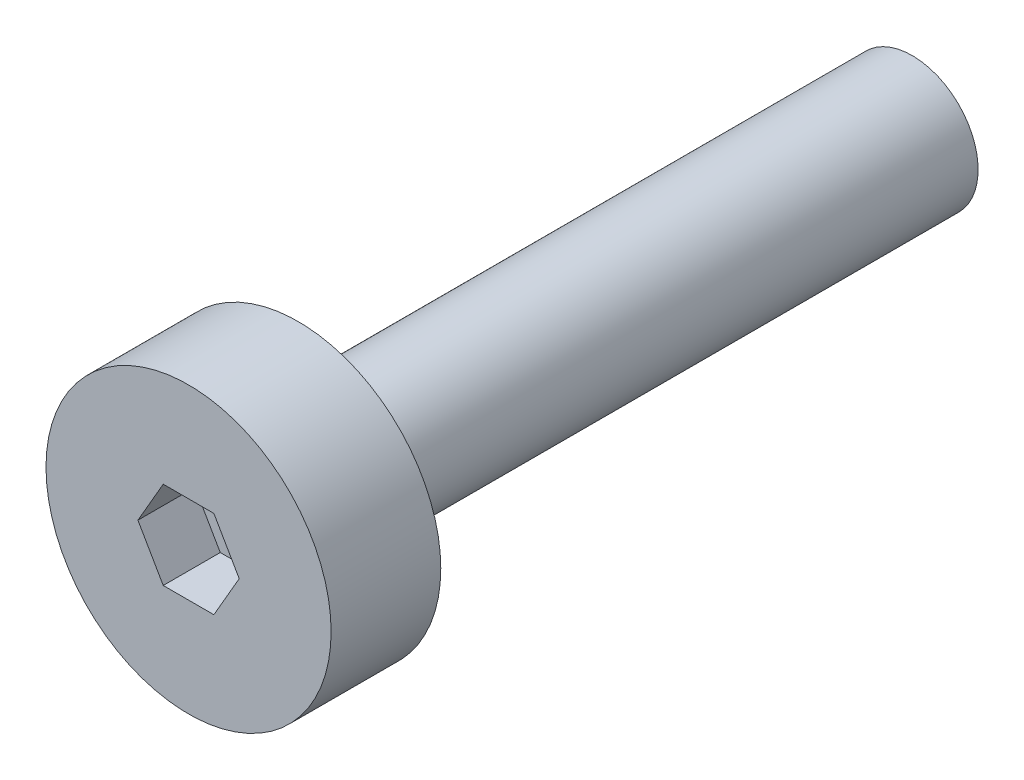
ISO-10303-21;
HEADER;
FILE_DESCRIPTION(('STEP AP214'),'2;1');
FILE_NAME('part.step','',(''),(''),'','','');
FILE_SCHEMA(('AUTOMOTIVE_DESIGN { 1 0 10303 214 1 1 1 1 }'));
ENDSEC;
DATA;
#1=APPLICATION_CONTEXT('core data for automotive mechanical design processes');
#2=APPLICATION_PROTOCOL_DEFINITION('international standard','automotive_design',2000,#1);
#3=PRODUCT_CONTEXT('',#1,'mechanical');
#4=PRODUCT('Part','Part','',(#3));
#5=PRODUCT_RELATED_PRODUCT_CATEGORY('part','',(#4));
#6=PRODUCT_DEFINITION_FORMATION('','',#4);
#7=PRODUCT_DEFINITION_CONTEXT('part definition',#1,'design');
#8=PRODUCT_DEFINITION('design','',#6,#7);
#9=PRODUCT_DEFINITION_SHAPE('','',#8);
#10=(LENGTH_UNIT() NAMED_UNIT(*) SI_UNIT(.MILLI.,.METRE.));
#11=(NAMED_UNIT(*) PLANE_ANGLE_UNIT() SI_UNIT($,.RADIAN.));
#12=(NAMED_UNIT(*) SI_UNIT($,.STERADIAN.) SOLID_ANGLE_UNIT());
#13=UNCERTAINTY_MEASURE_WITH_UNIT(LENGTH_MEASURE(1.E-05),#10,'distance_accuracy_value','');
#14=(GEOMETRIC_REPRESENTATION_CONTEXT(3) GLOBAL_UNCERTAINTY_ASSIGNED_CONTEXT((#13)) GLOBAL_UNIT_ASSIGNED_CONTEXT((#10,
#11,#12)) REPRESENTATION_CONTEXT('',''));
#15=CARTESIAN_POINT('',(0.,0.,0.));
#16=DIRECTION('',(0.,0.,1.));
#17=DIRECTION('',(1.,0.,0.));
#18=AXIS2_PLACEMENT_3D('',#15,#16,#17);
#19=CARTESIAN_POINT('',(0.,0.,1.2));
#20=DIRECTION('',(0.,0.,1.));
#21=DIRECTION('',(1.,0.,0.));
#22=AXIS2_PLACEMENT_3D('',#19,#20,#21);
#23=PLANE('',#22);
#24=DIRECTION('',(-0.50000000000019,0.866025403784329,0.));
#25=VECTOR('',#24,1.);
#26=CARTESIAN_POINT('',(1.154700538379,0.,1.2));
#27=LINE('',#26,#25);
#28=CARTESIAN_POINT('',(1.154700538379,0.,1.2));
#29=VERTEX_POINT('',#28);
#30=CARTESIAN_POINT('',(0.57735026919,1.,1.2));
#31=VERTEX_POINT('',#30);
#32=EDGE_CURVE('E9',#29,#31,#27,.T.);
#33=ORIENTED_EDGE('',*,*,#32,.T.);
#34=DIRECTION('',(-1.,0.,0.));
#35=VECTOR('',#34,1.);
#36=CARTESIAN_POINT('',(0.57735026919,1.,1.2));
#37=LINE('',#36,#35);
#38=CARTESIAN_POINT('',(-0.57735026919,1.,1.2));
#39=VERTEX_POINT('',#38);
#40=EDGE_CURVE('E112',#31,#39,#37,.T.);
#41=ORIENTED_EDGE('',*,*,#40,.T.);
#42=DIRECTION('',(-0.50000000000019,-0.866025403784329,0.));
#43=VECTOR('',#42,1.);
#44=CARTESIAN_POINT('',(-0.57735026919,1.,1.2));
#45=LINE('',#44,#43);
#46=CARTESIAN_POINT('',(-1.154700538379,0.,1.2));
#47=VERTEX_POINT('',#46);
#48=EDGE_CURVE('E129',#39,#47,#45,.T.);
#49=ORIENTED_EDGE('',*,*,#48,.T.);
#50=DIRECTION('',(0.50000000000019,-0.866025403784329,0.));
#51=VECTOR('',#50,1.);
#52=CARTESIAN_POINT('',(-1.154700538379,0.,1.2));
#53=LINE('',#52,#51);
#54=CARTESIAN_POINT('',(-0.57735026919,-1.,1.2));
#55=VERTEX_POINT('',#54);
#56=EDGE_CURVE('E110',#47,#55,#53,.T.);
#57=ORIENTED_EDGE('',*,*,#56,.T.);
#58=DIRECTION('',(1.,0.,0.));
#59=VECTOR('',#58,1.);
#60=CARTESIAN_POINT('',(-0.57735026919,-1.,1.2));
#61=LINE('',#60,#59);
#62=CARTESIAN_POINT('',(0.57735026919,-1.,1.2));
#63=VERTEX_POINT('',#62);
#64=EDGE_CURVE('E111',#55,#63,#61,.T.);
#65=ORIENTED_EDGE('',*,*,#64,.T.);
#66=DIRECTION('',(0.50000000000019,0.866025403784329,0.));
#67=VECTOR('',#66,1.);
#68=CARTESIAN_POINT('',(0.57735026919,-1.,1.2));
#69=LINE('',#68,#67);
#70=EDGE_CURVE('E90',#63,#29,#69,.T.);
#71=ORIENTED_EDGE('',*,*,#70,.T.);
#72=EDGE_LOOP('',(#33,#41,#49,#57,#65,#71));
#73=FACE_BOUND('',#72,.T.);
#74=ADVANCED_FACE('F14',(#73),#23,.T.);
#75=CARTESIAN_POINT('',(0.,0.,-14.));
#76=DIRECTION('',(0.,0.,-1.));
#77=DIRECTION('',(0.,-1.,0.));
#78=AXIS2_PLACEMENT_3D('',#75,#76,#77);
#79=PLANE('',#78);
#80=CARTESIAN_POINT('',(0.,0.,-14.));
#81=DIRECTION('',(0.,0.,-1.));
#82=DIRECTION('',(-1.,0.,0.));
#83=AXIS2_PLACEMENT_3D('',#80,#81,#82);
#84=CIRCLE('',#83,1.5);
#85=CARTESIAN_POINT('',(-1.5,0.,-14.));
#86=VERTEX_POINT('',#85);
#87=EDGE_CURVE('E86',#86,#86,#84,.T.);
#88=ORIENTED_EDGE('',*,*,#87,.T.);
#89=EDGE_LOOP('',(#88));
#90=FACE_BOUND('',#89,.T.);
#91=ADVANCED_FACE('F93',(#90),#79,.T.);
#92=CARTESIAN_POINT('',(1.154700538379,0.,1.2));
#93=DIRECTION('',(-0.866025403784329,-0.50000000000019,0.));
#94=DIRECTION('',(-0.50000000000019,0.866025403784329,0.));
#95=AXIS2_PLACEMENT_3D('',#92,#93,#94);
#96=PLANE('',#95);
#97=ORIENTED_EDGE('',*,*,#32,.F.);
#98=DIRECTION('',(0.,0.,1.));
#99=VECTOR('',#98,1.);
#100=CARTESIAN_POINT('',(1.154700538379,0.,1.2));
#101=LINE('',#100,#99);
#102=CARTESIAN_POINT('',(1.154700538379,0.,2.5));
#103=VERTEX_POINT('',#102);
#104=EDGE_CURVE('E132',#29,#103,#101,.T.);
#105=ORIENTED_EDGE('',*,*,#104,.T.);
#106=DIRECTION('',(-0.50000000000019,0.866025403784329,0.));
#107=VECTOR('',#106,1.);
#108=CARTESIAN_POINT('',(1.010362971082,0.25,2.5));
#109=LINE('',#108,#107);
#110=CARTESIAN_POINT('',(0.57735026919,1.,2.5));
#111=VERTEX_POINT('',#110);
#112=EDGE_CURVE('E102',#103,#111,#109,.T.);
#113=ORIENTED_EDGE('',*,*,#112,.T.);
#114=DIRECTION('',(0.,0.,1.));
#115=VECTOR('',#114,1.);
#116=CARTESIAN_POINT('',(0.57735026919,1.,1.2));
#117=LINE('',#116,#115);
#118=EDGE_CURVE('E25',#31,#111,#117,.T.);
#119=ORIENTED_EDGE('',*,*,#118,.F.);
#120=EDGE_LOOP('',(#97,#105,#113,#119));
#121=FACE_BOUND('',#120,.T.);
#122=ADVANCED_FACE('F180',(#121),#96,.T.);
#123=CARTESIAN_POINT('',(0.57735026919,1.,1.2));
#124=DIRECTION('',(0.,-1.,0.));
#125=DIRECTION('',(-1.,0.,0.));
#126=AXIS2_PLACEMENT_3D('',#123,#124,#125);
#127=PLANE('',#126);
#128=ORIENTED_EDGE('',*,*,#40,.F.);
#129=ORIENTED_EDGE('',*,*,#118,.T.);
#130=DIRECTION('',(-1.,0.,0.));
#131=VECTOR('',#130,1.);
#132=CARTESIAN_POINT('',(0.288675134595,1.,2.5));
#133=LINE('',#132,#131);
#134=CARTESIAN_POINT('',(-0.57735026919,1.,2.5));
#135=VERTEX_POINT('',#134);
#136=EDGE_CURVE('E124',#111,#135,#133,.T.);
#137=ORIENTED_EDGE('',*,*,#136,.T.);
#138=DIRECTION('',(0.,0.,1.));
#139=VECTOR('',#138,1.);
#140=CARTESIAN_POINT('',(-0.57735026919,1.,1.2));
#141=LINE('',#140,#139);
#142=EDGE_CURVE('E18',#39,#135,#141,.T.);
#143=ORIENTED_EDGE('',*,*,#142,.F.);
#144=EDGE_LOOP('',(#128,#129,#137,#143));
#145=FACE_BOUND('',#144,.T.);
#146=ADVANCED_FACE('F185',(#145),#127,.T.);
#147=CARTESIAN_POINT('',(-0.57735026919,1.,1.2));
#148=DIRECTION('',(0.866025403784329,-0.50000000000019,0.));
#149=DIRECTION('',(0.,0.,-1.));
#150=AXIS2_PLACEMENT_3D('',#147,#148,#149);
#151=PLANE('',#150);
#152=ORIENTED_EDGE('',*,*,#48,.F.);
#153=ORIENTED_EDGE('',*,*,#142,.T.);
#154=DIRECTION('',(-0.50000000000019,-0.866025403784329,0.));
#155=VECTOR('',#154,1.);
#156=CARTESIAN_POINT('',(-0.721687836487,0.75,2.5));
#157=LINE('',#156,#155);
#158=CARTESIAN_POINT('',(-1.154700538379,0.,2.5));
#159=VERTEX_POINT('',#158);
#160=EDGE_CURVE('E119',#135,#159,#157,.T.);
#161=ORIENTED_EDGE('',*,*,#160,.T.);
#162=DIRECTION('',(0.,0.,1.));
#163=VECTOR('',#162,1.);
#164=CARTESIAN_POINT('',(-1.154700538379,0.,1.2));
#165=LINE('',#164,#163);
#166=EDGE_CURVE('E125',#47,#159,#165,.T.);
#167=ORIENTED_EDGE('',*,*,#166,.F.);
#168=EDGE_LOOP('',(#152,#153,#161,#167));
#169=FACE_BOUND('',#168,.T.);
#170=ADVANCED_FACE('F191',(#169),#151,.T.);
#171=CARTESIAN_POINT('',(-1.154700538379,0.,1.2));
#172=DIRECTION('',(0.866025403784329,0.50000000000019,0.));
#173=DIRECTION('',(0.,0.,-1.));
#174=AXIS2_PLACEMENT_3D('',#171,#172,#173);
#175=PLANE('',#174);
#176=ORIENTED_EDGE('',*,*,#56,.F.);
#177=ORIENTED_EDGE('',*,*,#166,.T.);
#178=DIRECTION('',(0.50000000000019,-0.866025403784329,0.));
#179=VECTOR('',#178,1.);
#180=CARTESIAN_POINT('',(-1.010362971082,-0.25,2.5));
#181=LINE('',#180,#179);
#182=CARTESIAN_POINT('',(-0.57735026919,-1.,2.5));
#183=VERTEX_POINT('',#182);
#184=EDGE_CURVE('E115',#159,#183,#181,.T.);
#185=ORIENTED_EDGE('',*,*,#184,.T.);
#186=DIRECTION('',(0.,0.,1.));
#187=VECTOR('',#186,1.);
#188=CARTESIAN_POINT('',(-0.57735026919,-1.,1.2));
#189=LINE('',#188,#187);
#190=EDGE_CURVE('E108',#55,#183,#189,.T.);
#191=ORIENTED_EDGE('',*,*,#190,.F.);
#192=EDGE_LOOP('',(#176,#177,#185,#191));
#193=FACE_BOUND('',#192,.T.);
#194=ADVANCED_FACE('F195',(#193),#175,.T.);
#195=CARTESIAN_POINT('',(-0.57735026919,-1.,1.2));
#196=DIRECTION('',(0.,1.,0.));
#197=DIRECTION('',(1.,0.,0.));
#198=AXIS2_PLACEMENT_3D('',#195,#196,#197);
#199=PLANE('',#198);
#200=ORIENTED_EDGE('',*,*,#64,.F.);
#201=ORIENTED_EDGE('',*,*,#190,.T.);
#202=DIRECTION('',(1.,0.,0.));
#203=VECTOR('',#202,1.);
#204=CARTESIAN_POINT('',(-0.288675134595,-1.,2.5));
#205=LINE('',#204,#203);
#206=CARTESIAN_POINT('',(0.57735026919,-1.,2.5));
#207=VERTEX_POINT('',#206);
#208=EDGE_CURVE('E120',#183,#207,#205,.T.);
#209=ORIENTED_EDGE('',*,*,#208,.T.);
#210=DIRECTION('',(0.,0.,1.));
#211=VECTOR('',#210,1.);
#212=CARTESIAN_POINT('',(0.57735026919,-1.,1.2));
#213=LINE('',#212,#211);
#214=EDGE_CURVE('E134',#63,#207,#213,.T.);
#215=ORIENTED_EDGE('',*,*,#214,.F.);
#216=EDGE_LOOP('',(#200,#201,#209,#215));
#217=FACE_BOUND('',#216,.T.);
#218=ADVANCED_FACE('F174',(#217),#199,.T.);
#219=CARTESIAN_POINT('',(0.57735026919,-1.,1.2));
#220=DIRECTION('',(-0.866025403784329,0.50000000000019,0.));
#221=DIRECTION('',(0.,0.,1.));
#222=AXIS2_PLACEMENT_3D('',#219,#220,#221);
#223=PLANE('',#222);
#224=ORIENTED_EDGE('',*,*,#70,.F.);
#225=ORIENTED_EDGE('',*,*,#214,.T.);
#226=DIRECTION('',(0.50000000000019,0.866025403784329,0.));
#227=VECTOR('',#226,1.);
#228=CARTESIAN_POINT('',(0.721687836487,-0.75,2.5));
#229=LINE('',#228,#227);
#230=EDGE_CURVE('E95',#207,#103,#229,.T.);
#231=ORIENTED_EDGE('',*,*,#230,.T.);
#232=ORIENTED_EDGE('',*,*,#104,.F.);
#233=EDGE_LOOP('',(#224,#225,#231,#232));
#234=FACE_BOUND('',#233,.T.);
#235=ADVANCED_FACE('F16',(#234),#223,.T.);
#236=CARTESIAN_POINT('',(0.,0.,0.));
#237=DIRECTION('',(0.,0.,-1.));
#238=DIRECTION('',(-1.,0.,0.));
#239=AXIS2_PLACEMENT_3D('',#236,#237,#238);
#240=CYLINDRICAL_SURFACE('',#239,1.5);
#241=ORIENTED_EDGE('',*,*,#87,.F.);
#242=DIRECTION('',(0.,0.,-1.));
#243=VECTOR('',#242,1.);
#244=CARTESIAN_POINT('',(-1.5,0.,0.));
#245=LINE('',#244,#243);
#246=CARTESIAN_POINT('',(-1.5,0.,0.));
#247=VERTEX_POINT('',#246);
#248=EDGE_CURVE('E83',#247,#86,#245,.T.);
#249=ORIENTED_EDGE('',*,*,#248,.F.);
#250=CARTESIAN_POINT('',(0.,0.,0.));
#251=DIRECTION('',(0.,0.,-1.));
#252=DIRECTION('',(-1.,0.,0.));
#253=AXIS2_PLACEMENT_3D('',#250,#251,#252);
#254=CIRCLE('',#253,1.5);
#255=EDGE_CURVE('E88',#247,#247,#254,.T.);
#256=ORIENTED_EDGE('',*,*,#255,.T.);
#257=ORIENTED_EDGE('',*,*,#248,.T.);
#258=EDGE_LOOP('',(#241,#249,#256,#257));
#259=FACE_BOUND('',#258,.T.);
#260=ADVANCED_FACE('F85',(#259),#240,.T.);
#261=CARTESIAN_POINT('',(0.,0.,2.5));
#262=DIRECTION('',(0.,0.,-1.));
#263=DIRECTION('',(0.,-1.,0.));
#264=AXIS2_PLACEMENT_3D('',#261,#262,#263);
#265=PLANE('',#264);
#266=ORIENTED_EDGE('',*,*,#208,.F.);
#267=ORIENTED_EDGE('',*,*,#184,.F.);
#268=ORIENTED_EDGE('',*,*,#160,.F.);
#269=ORIENTED_EDGE('',*,*,#136,.F.);
#270=ORIENTED_EDGE('',*,*,#112,.F.);
#271=ORIENTED_EDGE('',*,*,#230,.F.);
#272=EDGE_LOOP('',(#266,#267,#268,#269,#270,#271));
#273=FACE_BOUND('',#272,.T.);
#274=CARTESIAN_POINT('',(0.,0.,2.5));
#275=DIRECTION('',(0.,0.,-1.));
#276=DIRECTION('',(-1.,0.,0.));
#277=AXIS2_PLACEMENT_3D('',#274,#275,#276);
#278=CIRCLE('',#277,3.25);
#279=CARTESIAN_POINT('',(-3.25,0.,2.5));
#280=VERTEX_POINT('',#279);
#281=EDGE_CURVE('E106',#280,#280,#278,.T.);
#282=ORIENTED_EDGE('',*,*,#281,.F.);
#283=EDGE_LOOP('',(#282));
#284=FACE_BOUND('',#283,.T.);
#285=ADVANCED_FACE('F197',(#273,#284),#265,.F.);
#286=CARTESIAN_POINT('',(0.,0.,0.));
#287=DIRECTION('',(0.,0.,-1.));
#288=DIRECTION('',(0.,-1.,0.));
#289=AXIS2_PLACEMENT_3D('',#286,#287,#288);
#290=PLANE('',#289);
#291=ORIENTED_EDGE('',*,*,#255,.F.);
#292=EDGE_LOOP('',(#291));
#293=FACE_BOUND('',#292,.T.);
#294=CARTESIAN_POINT('',(0.,0.,0.));
#295=DIRECTION('',(0.,0.,-1.));
#296=DIRECTION('',(-1.,0.,0.));
#297=AXIS2_PLACEMENT_3D('',#294,#295,#296);
#298=CIRCLE('',#297,3.25);
#299=CARTESIAN_POINT('',(-3.25,0.,0.));
#300=VERTEX_POINT('',#299);
#301=EDGE_CURVE('E159',#300,#300,#298,.T.);
#302=ORIENTED_EDGE('',*,*,#301,.T.);
#303=EDGE_LOOP('',(#302));
#304=FACE_BOUND('',#303,.T.);
#305=ADVANCED_FACE('F235',(#293,#304),#290,.T.);
#306=CARTESIAN_POINT('',(0.,0.,2.5));
#307=DIRECTION('',(0.,0.,-1.));
#308=DIRECTION('',(-1.,0.,0.));
#309=AXIS2_PLACEMENT_3D('',#306,#307,#308);
#310=CYLINDRICAL_SURFACE('',#309,3.25);
#311=ORIENTED_EDGE('',*,*,#301,.F.);
#312=DIRECTION('',(0.,0.,-1.));
#313=VECTOR('',#312,1.);
#314=CARTESIAN_POINT('',(-3.25,0.,2.5));
#315=LINE('',#314,#313);
#316=EDGE_CURVE('E162',#280,#300,#315,.T.);
#317=ORIENTED_EDGE('',*,*,#316,.F.);
#318=ORIENTED_EDGE('',*,*,#281,.T.);
#319=ORIENTED_EDGE('',*,*,#316,.T.);
#320=EDGE_LOOP('',(#311,#317,#318,#319));
#321=FACE_BOUND('',#320,.T.);
#322=ADVANCED_FACE('F240',(#321),#310,.T.);
#323=CLOSED_SHELL('',(#74,#91,#122,#146,#170,#194,#218,#235,#260,#285,#305,#322));
#324=MANIFOLD_SOLID_BREP('B1',#323);
#325=ADVANCED_BREP_SHAPE_REPRESENTATION('',(#18,#324),#14);
#326=SHAPE_DEFINITION_REPRESENTATION(#9,#325);
ENDSEC;
END-ISO-10303-21;
